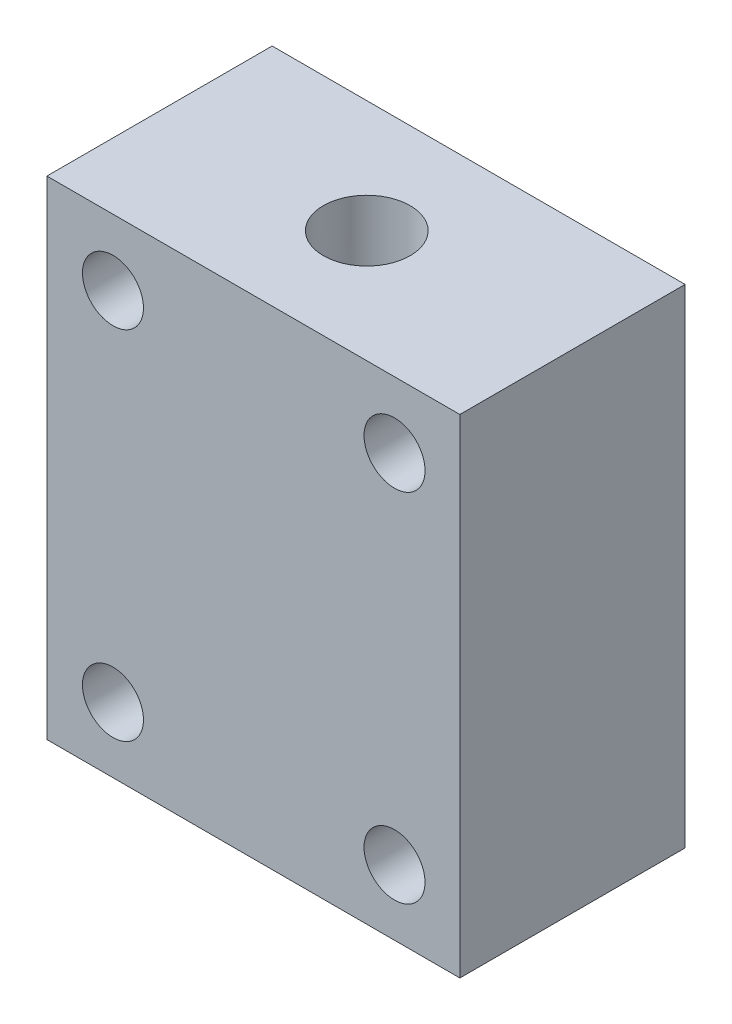
ISO-10303-21;
HEADER;
FILE_DESCRIPTION(('STEP AP214'),'2;1');
FILE_NAME('part.step','',(''),(''),'','','');
FILE_SCHEMA(('AUTOMOTIVE_DESIGN { 1 0 10303 214 1 1 1 1 }'));
ENDSEC;
DATA;
#1=APPLICATION_CONTEXT('core data for automotive mechanical design processes');
#2=APPLICATION_PROTOCOL_DEFINITION('international standard','automotive_design',2000,#1);
#3=PRODUCT_CONTEXT('',#1,'mechanical');
#4=PRODUCT('Part','Part','',(#3));
#5=PRODUCT_RELATED_PRODUCT_CATEGORY('part','',(#4));
#6=PRODUCT_DEFINITION_FORMATION('','',#4);
#7=PRODUCT_DEFINITION_CONTEXT('part definition',#1,'design');
#8=PRODUCT_DEFINITION('design','',#6,#7);
#9=PRODUCT_DEFINITION_SHAPE('','',#8);
#10=(LENGTH_UNIT() NAMED_UNIT(*) SI_UNIT(.MILLI.,.METRE.));
#11=(NAMED_UNIT(*) PLANE_ANGLE_UNIT() SI_UNIT($,.RADIAN.));
#12=(NAMED_UNIT(*) SI_UNIT($,.STERADIAN.) SOLID_ANGLE_UNIT());
#13=UNCERTAINTY_MEASURE_WITH_UNIT(LENGTH_MEASURE(1.E-05),#10,'distance_accuracy_value','');
#14=(GEOMETRIC_REPRESENTATION_CONTEXT(3) GLOBAL_UNCERTAINTY_ASSIGNED_CONTEXT((#13)) GLOBAL_UNIT_ASSIGNED_CONTEXT((#10,
#11,#12)) REPRESENTATION_CONTEXT('',''));
#15=CARTESIAN_POINT('',(0.,0.,0.));
#16=DIRECTION('',(0.,0.,1.));
#17=DIRECTION('',(1.,0.,0.));
#18=AXIS2_PLACEMENT_3D('',#15,#16,#17);
#19=CARTESIAN_POINT('',(34.925,41.275,19.05));
#20=DIRECTION('',(0.,-1.,0.));
#21=DIRECTION('',(0.,0.,-1.));
#22=AXIS2_PLACEMENT_3D('',#19,#20,#21);
#23=PLANE('',#22);
#24=CARTESIAN_POINT('',(0.126999999999997,41.275,0.));
#25=DIRECTION('',(0.,1.,0.));
#26=DIRECTION('',(0.,0.,1.));
#27=AXIS2_PLACEMENT_3D('',#24,#25,#26);
#28=CIRCLE('',#27,7.3421875);
#29=CARTESIAN_POINT('',(0.126999999999997,41.275,7.3421875));
#30=VERTEX_POINT('',#29);
#31=EDGE_CURVE('E224',#30,#30,#28,.T.);
#32=ORIENTED_EDGE('',*,*,#31,.F.);
#33=EDGE_LOOP('',(#32));
#34=FACE_BOUND('',#33,.T.);
#35=DIRECTION('',(-1.,0.,0.));
#36=VECTOR('',#35,1.);
#37=CARTESIAN_POINT('',(34.925,41.275,-19.05));
#38=LINE('',#37,#36);
#39=CARTESIAN_POINT('',(34.925,41.275,-19.05));
#40=VERTEX_POINT('',#39);
#41=CARTESIAN_POINT('',(-34.925,41.275,-19.05));
#42=VERTEX_POINT('',#41);
#43=EDGE_CURVE('E178',#40,#42,#38,.T.);
#44=ORIENTED_EDGE('',*,*,#43,.T.);
#45=DIRECTION('',(0.,0.,-1.));
#46=VECTOR('',#45,1.);
#47=CARTESIAN_POINT('',(-34.925,41.275,19.05));
#48=LINE('',#47,#46);
#49=CARTESIAN_POINT('',(-34.925,41.275,19.05));
#50=VERTEX_POINT('',#49);
#51=EDGE_CURVE('E205',#50,#42,#48,.T.);
#52=ORIENTED_EDGE('',*,*,#51,.F.);
#53=DIRECTION('',(-1.,0.,0.));
#54=VECTOR('',#53,1.);
#55=CARTESIAN_POINT('',(34.925,41.275,19.05));
#56=LINE('',#55,#54);
#57=CARTESIAN_POINT('',(34.925,41.275,19.05));
#58=VERTEX_POINT('',#57);
#59=EDGE_CURVE('E179',#58,#50,#56,.T.);
#60=ORIENTED_EDGE('',*,*,#59,.F.);
#61=DIRECTION('',(0.,0.,-1.));
#62=VECTOR('',#61,1.);
#63=CARTESIAN_POINT('',(34.925,41.275,19.05));
#64=LINE('',#63,#62);
#65=EDGE_CURVE('E189',#58,#40,#64,.T.);
#66=ORIENTED_EDGE('',*,*,#65,.T.);
#67=EDGE_LOOP('',(#44,#52,#60,#66));
#68=FACE_BOUND('',#67,.T.);
#69=ADVANCED_FACE('F43',(#34,#68),#23,.F.);
#70=CARTESIAN_POINT('',(-34.925,-41.275,19.05));
#71=DIRECTION('',(1.,0.,0.));
#72=DIRECTION('',(0.,0.,-1.));
#73=AXIS2_PLACEMENT_3D('',#70,#71,#72);
#74=PLANE('',#73);
#75=DIRECTION('',(0.,-1.,0.));
#76=VECTOR('',#75,1.);
#77=CARTESIAN_POINT('',(-34.925,-41.275,-19.05));
#78=LINE('',#77,#76);
#79=CARTESIAN_POINT('',(-34.925,-41.275,-19.05));
#80=VERTEX_POINT('',#79);
#81=EDGE_CURVE('E192',#42,#80,#78,.T.);
#82=ORIENTED_EDGE('',*,*,#81,.T.);
#83=DIRECTION('',(0.,0.,-1.));
#84=VECTOR('',#83,1.);
#85=CARTESIAN_POINT('',(-34.925,-41.275,19.05));
#86=LINE('',#85,#84);
#87=CARTESIAN_POINT('',(-34.925,-41.275,19.05));
#88=VERTEX_POINT('',#87);
#89=EDGE_CURVE('E202',#88,#80,#86,.T.);
#90=ORIENTED_EDGE('',*,*,#89,.F.);
#91=DIRECTION('',(0.,-1.,0.));
#92=VECTOR('',#91,1.);
#93=CARTESIAN_POINT('',(-34.925,-41.275,19.05));
#94=LINE('',#93,#92);
#95=EDGE_CURVE('E182',#50,#88,#94,.T.);
#96=ORIENTED_EDGE('',*,*,#95,.F.);
#97=ORIENTED_EDGE('',*,*,#51,.T.);
#98=EDGE_LOOP('',(#82,#90,#96,#97));
#99=FACE_BOUND('',#98,.T.);
#100=ADVANCED_FACE('F232',(#99),#74,.F.);
#101=CARTESIAN_POINT('',(34.925,-41.275,19.05));
#102=DIRECTION('',(0.,1.,0.));
#103=DIRECTION('',(0.,0.,1.));
#104=AXIS2_PLACEMENT_3D('',#101,#102,#103);
#105=PLANE('',#104);
#106=DIRECTION('',(1.,0.,0.));
#107=VECTOR('',#106,1.);
#108=CARTESIAN_POINT('',(34.925,-41.275,-19.05));
#109=LINE('',#108,#107);
#110=CARTESIAN_POINT('',(34.925,-41.275,-19.05));
#111=VERTEX_POINT('',#110);
#112=EDGE_CURVE('E194',#80,#111,#109,.T.);
#113=ORIENTED_EDGE('',*,*,#112,.T.);
#114=DIRECTION('',(0.,0.,-1.));
#115=VECTOR('',#114,1.);
#116=CARTESIAN_POINT('',(34.925,-41.275,19.05));
#117=LINE('',#116,#115);
#118=CARTESIAN_POINT('',(34.925,-41.275,19.05));
#119=VERTEX_POINT('',#118);
#120=EDGE_CURVE('E199',#119,#111,#117,.T.);
#121=ORIENTED_EDGE('',*,*,#120,.F.);
#122=DIRECTION('',(1.,0.,0.));
#123=VECTOR('',#122,1.);
#124=CARTESIAN_POINT('',(34.925,-41.275,19.05));
#125=LINE('',#124,#123);
#126=EDGE_CURVE('E185',#88,#119,#125,.T.);
#127=ORIENTED_EDGE('',*,*,#126,.F.);
#128=ORIENTED_EDGE('',*,*,#89,.T.);
#129=EDGE_LOOP('',(#113,#121,#127,#128));
#130=FACE_BOUND('',#129,.T.);
#131=ADVANCED_FACE('F251',(#130),#105,.F.);
#132=CARTESIAN_POINT('',(34.925,-41.275,19.05));
#133=DIRECTION('',(-1.,0.,0.));
#134=DIRECTION('',(0.,0.,1.));
#135=AXIS2_PLACEMENT_3D('',#132,#133,#134);
#136=PLANE('',#135);
#137=DIRECTION('',(0.,1.,0.));
#138=VECTOR('',#137,1.);
#139=CARTESIAN_POINT('',(34.925,-41.275,-19.05));
#140=LINE('',#139,#138);
#141=EDGE_CURVE('E183',#111,#40,#140,.T.);
#142=ORIENTED_EDGE('',*,*,#141,.T.);
#143=ORIENTED_EDGE('',*,*,#65,.F.);
#144=DIRECTION('',(0.,1.,0.));
#145=VECTOR('',#144,1.);
#146=CARTESIAN_POINT('',(34.925,-41.275,19.05));
#147=LINE('',#146,#145);
#148=EDGE_CURVE('E187',#119,#58,#147,.T.);
#149=ORIENTED_EDGE('',*,*,#148,.F.);
#150=ORIENTED_EDGE('',*,*,#120,.T.);
#151=EDGE_LOOP('',(#142,#143,#149,#150));
#152=FACE_BOUND('',#151,.T.);
#153=ADVANCED_FACE('F249',(#152),#136,.F.);
#154=CARTESIAN_POINT('',(0.,0.,19.05));
#155=DIRECTION('',(0.,0.,-1.));
#156=DIRECTION('',(-1.,0.,0.));
#157=AXIS2_PLACEMENT_3D('',#154,#155,#156);
#158=PLANE('',#157);
#159=CARTESIAN_POINT('',(23.876,-30.226,19.05));
#160=DIRECTION('',(0.,0.,-1.));
#161=DIRECTION('',(-1.,0.,0.));
#162=AXIS2_PLACEMENT_3D('',#159,#160,#161);
#163=CIRCLE('',#162,5.15937499999998);
#164=CARTESIAN_POINT('',(18.716625,-30.226,19.05));
#165=VERTEX_POINT('',#164);
#166=EDGE_CURVE('E157',#165,#165,#163,.T.);
#167=ORIENTED_EDGE('',*,*,#166,.T.);
#168=EDGE_LOOP('',(#167));
#169=FACE_BOUND('',#168,.T.);
#170=CARTESIAN_POINT('',(23.876,30.099,19.05));
#171=DIRECTION('',(0.,0.,-1.));
#172=DIRECTION('',(-1.,0.,0.));
#173=AXIS2_PLACEMENT_3D('',#170,#171,#172);
#174=CIRCLE('',#173,5.15937499999998);
#175=CARTESIAN_POINT('',(18.716625,30.099,19.05));
#176=VERTEX_POINT('',#175);
#177=EDGE_CURVE('E163',#176,#176,#174,.T.);
#178=ORIENTED_EDGE('',*,*,#177,.T.);
#179=EDGE_LOOP('',(#178));
#180=FACE_BOUND('',#179,.T.);
#181=CARTESIAN_POINT('',(-23.749,-30.226,19.05));
#182=DIRECTION('',(0.,0.,-1.));
#183=DIRECTION('',(-1.,0.,0.));
#184=AXIS2_PLACEMENT_3D('',#181,#182,#183);
#185=CIRCLE('',#184,5.15937499999998);
#186=CARTESIAN_POINT('',(-28.908375,-30.226,19.05));
#187=VERTEX_POINT('',#186);
#188=EDGE_CURVE('E169',#187,#187,#185,.T.);
#189=ORIENTED_EDGE('',*,*,#188,.T.);
#190=EDGE_LOOP('',(#189));
#191=FACE_BOUND('',#190,.T.);
#192=CARTESIAN_POINT('',(-23.749,30.099,19.05));
#193=DIRECTION('',(0.,0.,-1.));
#194=DIRECTION('',(-1.,0.,0.));
#195=AXIS2_PLACEMENT_3D('',#192,#193,#194);
#196=CIRCLE('',#195,5.15937499999998);
#197=CARTESIAN_POINT('',(-28.908375,30.099,19.05));
#198=VERTEX_POINT('',#197);
#199=EDGE_CURVE('E175',#198,#198,#196,.T.);
#200=ORIENTED_EDGE('',*,*,#199,.T.);
#201=EDGE_LOOP('',(#200));
#202=FACE_BOUND('',#201,.T.);
#203=ORIENTED_EDGE('',*,*,#59,.T.);
#204=ORIENTED_EDGE('',*,*,#95,.T.);
#205=ORIENTED_EDGE('',*,*,#126,.T.);
#206=ORIENTED_EDGE('',*,*,#148,.T.);
#207=EDGE_LOOP('',(#203,#204,#205,#206));
#208=FACE_BOUND('',#207,.T.);
#209=ADVANCED_FACE('F245',(#169,#180,#191,#202,#208),#158,.F.);
#210=CARTESIAN_POINT('',(0.,0.,-19.05));
#211=DIRECTION('',(0.,0.,-1.));
#212=DIRECTION('',(-1.,0.,0.));
#213=AXIS2_PLACEMENT_3D('',#210,#211,#212);
#214=PLANE('',#213);
#215=CARTESIAN_POINT('',(0.126999999999997,-17.653,-19.05));
#216=DIRECTION('',(0.,0.,1.));
#217=DIRECTION('',(1.,0.,0.));
#218=AXIS2_PLACEMENT_3D('',#215,#216,#217);
#219=CIRCLE('',#218,12.7254);
#220=CARTESIAN_POINT('',(12.8524,-17.653,-19.05));
#221=VERTEX_POINT('',#220);
#222=EDGE_CURVE('E143',#221,#221,#219,.T.);
#223=ORIENTED_EDGE('',*,*,#222,.T.);
#224=EDGE_LOOP('',(#223));
#225=FACE_BOUND('',#224,.T.);
#226=CARTESIAN_POINT('',(0.126999999999997,17.399,-19.05));
#227=DIRECTION('',(0.,0.,1.));
#228=DIRECTION('',(1.,0.,0.));
#229=AXIS2_PLACEMENT_3D('',#226,#227,#228);
#230=CIRCLE('',#229,12.7254);
#231=CARTESIAN_POINT('',(12.8524,17.399,-19.05));
#232=VERTEX_POINT('',#231);
#233=EDGE_CURVE('E138',#232,#232,#230,.T.);
#234=ORIENTED_EDGE('',*,*,#233,.T.);
#235=EDGE_LOOP('',(#234));
#236=FACE_BOUND('',#235,.T.);
#237=CARTESIAN_POINT('',(23.876,-30.226,-19.05));
#238=DIRECTION('',(0.,0.,-1.));
#239=DIRECTION('',(-1.,0.,0.));
#240=AXIS2_PLACEMENT_3D('',#237,#238,#239);
#241=CIRCLE('',#240,5.15937499999999);
#242=CARTESIAN_POINT('',(18.716625,-30.226,-19.05));
#243=VERTEX_POINT('',#242);
#244=EDGE_CURVE('E150',#243,#243,#241,.T.);
#245=ORIENTED_EDGE('',*,*,#244,.F.);
#246=EDGE_LOOP('',(#245));
#247=FACE_BOUND('',#246,.T.);
#248=CARTESIAN_POINT('',(23.876,30.099,-19.05));
#249=DIRECTION('',(0.,0.,-1.));
#250=DIRECTION('',(-1.,0.,0.));
#251=AXIS2_PLACEMENT_3D('',#248,#249,#250);
#252=CIRCLE('',#251,5.15937499999999);
#253=CARTESIAN_POINT('',(18.716625,30.099,-19.05));
#254=VERTEX_POINT('',#253);
#255=EDGE_CURVE('E160',#254,#254,#252,.T.);
#256=ORIENTED_EDGE('',*,*,#255,.F.);
#257=EDGE_LOOP('',(#256));
#258=FACE_BOUND('',#257,.T.);
#259=CARTESIAN_POINT('',(-23.749,-30.226,-19.05));
#260=DIRECTION('',(0.,0.,-1.));
#261=DIRECTION('',(-1.,0.,0.));
#262=AXIS2_PLACEMENT_3D('',#259,#260,#261);
#263=CIRCLE('',#262,5.15937499999999);
#264=CARTESIAN_POINT('',(-28.908375,-30.226,-19.05));
#265=VERTEX_POINT('',#264);
#266=EDGE_CURVE('E166',#265,#265,#263,.T.);
#267=ORIENTED_EDGE('',*,*,#266,.F.);
#268=EDGE_LOOP('',(#267));
#269=FACE_BOUND('',#268,.T.);
#270=CARTESIAN_POINT('',(-23.749,30.099,-19.05));
#271=DIRECTION('',(0.,0.,-1.));
#272=DIRECTION('',(-1.,0.,0.));
#273=AXIS2_PLACEMENT_3D('',#270,#271,#272);
#274=CIRCLE('',#273,5.15937499999999);
#275=CARTESIAN_POINT('',(-28.908375,30.099,-19.05));
#276=VERTEX_POINT('',#275);
#277=EDGE_CURVE('E172',#276,#276,#274,.T.);
#278=ORIENTED_EDGE('',*,*,#277,.F.);
#279=EDGE_LOOP('',(#278));
#280=FACE_BOUND('',#279,.T.);
#281=ORIENTED_EDGE('',*,*,#43,.F.);
#282=ORIENTED_EDGE('',*,*,#141,.F.);
#283=ORIENTED_EDGE('',*,*,#112,.F.);
#284=ORIENTED_EDGE('',*,*,#81,.F.);
#285=EDGE_LOOP('',(#281,#282,#283,#284));
#286=FACE_BOUND('',#285,.T.);
#287=ADVANCED_FACE('F239',(#225,#236,#247,#258,#269,#280,#286),#214,.T.);
#288=CARTESIAN_POINT('',(-23.749,30.099,-19.05));
#289=DIRECTION('',(0.,0.,-1.));
#290=DIRECTION('',(-1.,0.,0.));
#291=AXIS2_PLACEMENT_3D('',#288,#289,#290);
#292=CYLINDRICAL_SURFACE('',#291,5.15937499999998);
#293=ORIENTED_EDGE('',*,*,#199,.F.);
#294=EDGE_LOOP('',(#293));
#295=FACE_BOUND('',#294,.T.);
#296=ORIENTED_EDGE('',*,*,#277,.T.);
#297=EDGE_LOOP('',(#296));
#298=FACE_BOUND('',#297,.T.);
#299=ADVANCED_FACE('F262',(#295,#298),#292,.F.);
#300=CARTESIAN_POINT('',(-23.749,-30.226,-19.05));
#301=DIRECTION('',(0.,0.,-1.));
#302=DIRECTION('',(-1.,0.,0.));
#303=AXIS2_PLACEMENT_3D('',#300,#301,#302);
#304=CYLINDRICAL_SURFACE('',#303,5.15937499999998);
#305=ORIENTED_EDGE('',*,*,#188,.F.);
#306=EDGE_LOOP('',(#305));
#307=FACE_BOUND('',#306,.T.);
#308=ORIENTED_EDGE('',*,*,#266,.T.);
#309=EDGE_LOOP('',(#308));
#310=FACE_BOUND('',#309,.T.);
#311=ADVANCED_FACE('F269',(#307,#310),#304,.F.);
#312=CARTESIAN_POINT('',(23.876,30.099,-19.05));
#313=DIRECTION('',(0.,0.,-1.));
#314=DIRECTION('',(-1.,0.,0.));
#315=AXIS2_PLACEMENT_3D('',#312,#313,#314);
#316=CYLINDRICAL_SURFACE('',#315,5.15937499999998);
#317=ORIENTED_EDGE('',*,*,#177,.F.);
#318=EDGE_LOOP('',(#317));
#319=FACE_BOUND('',#318,.T.);
#320=ORIENTED_EDGE('',*,*,#255,.T.);
#321=EDGE_LOOP('',(#320));
#322=FACE_BOUND('',#321,.T.);
#323=ADVANCED_FACE('F273',(#319,#322),#316,.F.);
#324=CARTESIAN_POINT('',(23.876,-30.226,-19.05));
#325=DIRECTION('',(0.,0.,-1.));
#326=DIRECTION('',(-1.,0.,0.));
#327=AXIS2_PLACEMENT_3D('',#324,#325,#326);
#328=CYLINDRICAL_SURFACE('',#327,5.15937499999998);
#329=ORIENTED_EDGE('',*,*,#166,.F.);
#330=EDGE_LOOP('',(#329));
#331=FACE_BOUND('',#330,.T.);
#332=ORIENTED_EDGE('',*,*,#244,.T.);
#333=EDGE_LOOP('',(#332));
#334=FACE_BOUND('',#333,.T.);
#335=ADVANCED_FACE('F277',(#331,#334),#328,.F.);
#336=CARTESIAN_POINT('',(0.126999999999997,-17.653,-16.2306));
#337=DIRECTION('',(0.,0.,-1.));
#338=DIRECTION('',(-1.,0.,0.));
#339=AXIS2_PLACEMENT_3D('',#336,#337,#338);
#340=CYLINDRICAL_SURFACE('',#339,12.7254);
#341=CARTESIAN_POINT('',(0.126999999999997,-17.653,-16.2306));
#342=DIRECTION('',(0.,0.,1.));
#343=DIRECTION('',(1.,0.,0.));
#344=AXIS2_PLACEMENT_3D('',#341,#342,#343);
#345=CIRCLE('',#344,12.7254);
#346=CARTESIAN_POINT('',(12.8524,-17.653,-16.2306));
#347=VERTEX_POINT('',#346);
#348=EDGE_CURVE('E211',#347,#347,#345,.T.);
#349=ORIENTED_EDGE('',*,*,#348,.T.);
#350=EDGE_LOOP('',(#349));
#351=FACE_BOUND('',#350,.T.);
#352=ORIENTED_EDGE('',*,*,#222,.F.);
#353=EDGE_LOOP('',(#352));
#354=FACE_BOUND('',#353,.T.);
#355=ADVANCED_FACE('F281',(#351,#354),#340,.F.);
#356=CARTESIAN_POINT('',(0.126999999999997,-17.653,-16.2306));
#357=DIRECTION('',(0.,0.,1.));
#358=DIRECTION('',(1.,0.,0.));
#359=AXIS2_PLACEMENT_3D('',#356,#357,#358);
#360=PLANE('',#359);
#361=CARTESIAN_POINT('',(0.126999999999997,-17.653,-16.2306));
#362=DIRECTION('',(0.,0.,1.));
#363=DIRECTION('',(1.,0.,0.));
#364=AXIS2_PLACEMENT_3D('',#361,#362,#363);
#365=CIRCLE('',#364,7.3421875);
#366=CARTESIAN_POINT('',(7.4691875,-17.653,-16.2306));
#367=VERTEX_POINT('',#366);
#368=EDGE_CURVE('E208',#367,#367,#365,.T.);
#369=ORIENTED_EDGE('',*,*,#368,.T.);
#370=EDGE_LOOP('',(#369));
#371=FACE_BOUND('',#370,.T.);
#372=ORIENTED_EDGE('',*,*,#348,.F.);
#373=EDGE_LOOP('',(#372));
#374=FACE_BOUND('',#373,.T.);
#375=ADVANCED_FACE('F306',(#371,#374),#360,.F.);
#376=CARTESIAN_POINT('',(0.126999999999997,17.399,-16.2306));
#377=DIRECTION('',(0.,0.,-1.));
#378=DIRECTION('',(-1.,0.,0.));
#379=AXIS2_PLACEMENT_3D('',#376,#377,#378);
#380=CYLINDRICAL_SURFACE('',#379,12.7254);
#381=CARTESIAN_POINT('',(0.126999999999997,17.399,-16.2306));
#382=DIRECTION('',(0.,0.,1.));
#383=DIRECTION('',(1.,0.,0.));
#384=AXIS2_PLACEMENT_3D('',#381,#382,#383);
#385=CIRCLE('',#384,12.7254);
#386=CARTESIAN_POINT('',(12.8524,17.399,-16.2306));
#387=VERTEX_POINT('',#386);
#388=EDGE_CURVE('E136',#387,#387,#385,.T.);
#389=ORIENTED_EDGE('',*,*,#388,.T.);
#390=EDGE_LOOP('',(#389));
#391=FACE_BOUND('',#390,.T.);
#392=ORIENTED_EDGE('',*,*,#233,.F.);
#393=EDGE_LOOP('',(#392));
#394=FACE_BOUND('',#393,.T.);
#395=ADVANCED_FACE('F302',(#391,#394),#380,.F.);
#396=CARTESIAN_POINT('',(0.126999999999997,17.399,-16.2306));
#397=DIRECTION('',(0.,0.,1.));
#398=DIRECTION('',(1.,0.,0.));
#399=AXIS2_PLACEMENT_3D('',#396,#397,#398);
#400=PLANE('',#399);
#401=CARTESIAN_POINT('',(0.126999999999997,17.399,-16.2306));
#402=DIRECTION('',(0.,0.,1.));
#403=DIRECTION('',(1.,0.,0.));
#404=AXIS2_PLACEMENT_3D('',#401,#402,#403);
#405=CIRCLE('',#404,7.3421875);
#406=CARTESIAN_POINT('',(7.4691875,17.399,-16.2306));
#407=VERTEX_POINT('',#406);
#408=EDGE_CURVE('E154',#407,#407,#405,.T.);
#409=ORIENTED_EDGE('',*,*,#408,.T.);
#410=EDGE_LOOP('',(#409));
#411=FACE_BOUND('',#410,.T.);
#412=ORIENTED_EDGE('',*,*,#388,.F.);
#413=EDGE_LOOP('',(#412));
#414=FACE_BOUND('',#413,.T.);
#415=ADVANCED_FACE('F298',(#411,#414),#400,.F.);
#416=CARTESIAN_POINT('',(0.126999999999997,-17.653,9.398));
#417=DIRECTION('',(0.,0.,1.));
#418=DIRECTION('',(1.,0.,0.));
#419=AXIS2_PLACEMENT_3D('',#416,#417,#418);
#420=PLANE('',#419);
#421=CARTESIAN_POINT('',(0.126999999999997,-17.653,9.398));
#422=DIRECTION('',(0.,0.,1.));
#423=DIRECTION('',(1.,0.,0.));
#424=AXIS2_PLACEMENT_3D('',#421,#422,#423);
#425=CIRCLE('',#424,7.3421875);
#426=CARTESIAN_POINT('',(7.4691875,-17.653,9.398));
#427=VERTEX_POINT('',#426);
#428=EDGE_CURVE('E147',#427,#427,#425,.T.);
#429=ORIENTED_EDGE('',*,*,#428,.F.);
#430=EDGE_LOOP('',(#429));
#431=FACE_BOUND('',#430,.T.);
#432=ADVANCED_FACE('F295',(#431),#420,.F.);
#433=CARTESIAN_POINT('',(0.126999999999997,-17.653,9.398));
#434=DIRECTION('',(0.,0.,-1.));
#435=DIRECTION('',(-1.,0.,0.));
#436=AXIS2_PLACEMENT_3D('',#433,#434,#435);
#437=CYLINDRICAL_SURFACE('',#436,7.3421875);
#438=CARTESIAN_POINT('',(0.126999999999997,-17.653,0.));
#439=DIRECTION('',(0.,-0.707106781186547,-0.707106781186547));
#440=DIRECTION('',(0.,0.707106781186547,-0.707106781186547));
#441=AXIS2_PLACEMENT_3D('',#438,#439,#440);
#442=ELLIPSE('',#441,10.3834211399862,7.3421875);
#443=CARTESIAN_POINT('',(7.30927967188387,-19.177,1.52399999999999));
#444=VERTEX_POINT('',#443);
#445=CARTESIAN_POINT('',(7.4691875,-17.653,0.));
#446=VERTEX_POINT('',#445);
#447=EDGE_CURVE('E57',#444,#446,#442,.F.);
#448=ORIENTED_EDGE('',*,*,#447,.F.);
#449=DIRECTION('',(0.,0.,-1.));
#450=VECTOR('',#449,1.);
#451=CARTESIAN_POINT('',(7.30927967188387,-19.177,9.398));
#452=LINE('',#451,#450);
#453=CARTESIAN_POINT('',(7.30927967188387,-19.177,-1.52399999999999));
#454=VERTEX_POINT('',#453);
#455=EDGE_CURVE('E11',#444,#454,#452,.T.);
#456=ORIENTED_EDGE('',*,*,#455,.T.);
#457=CARTESIAN_POINT('',(0.126999999999997,-17.653,0.));
#458=DIRECTION('',(0.,0.707106781186547,-0.707106781186547));
#459=DIRECTION('',(0.,-0.707106781186547,-0.707106781186547));
#460=AXIS2_PLACEMENT_3D('',#457,#458,#459);
#461=ELLIPSE('',#460,10.3834211399862,7.3421875);
#462=EDGE_CURVE('E113',#446,#454,#461,.T.);
#463=ORIENTED_EDGE('',*,*,#462,.F.);
#464=CARTESIAN_POINT('',(0.126999999999997,-17.653,0.));
#465=DIRECTION('',(0.,-0.707106781186547,-0.707106781186547));
#466=DIRECTION('',(0.,0.707106781186547,-0.707106781186547));
#467=AXIS2_PLACEMENT_3D('',#464,#465,#466);
#468=ELLIPSE('',#467,10.3834211399862,7.3421875);
#469=CARTESIAN_POINT('',(-7.2151875,-17.653,0.));
#470=VERTEX_POINT('',#469);
#471=EDGE_CURVE('E121',#470,#446,#468,.T.);
#472=ORIENTED_EDGE('',*,*,#471,.F.);
#473=CARTESIAN_POINT('',(-7.05527967188387,-19.177,-1.52399999999999));
#474=VERTEX_POINT('',#473);
#475=EDGE_CURVE('E124',#474,#470,#461,.T.);
#476=ORIENTED_EDGE('',*,*,#475,.F.);
#477=DIRECTION('',(0.,0.,-1.));
#478=VECTOR('',#477,1.);
#479=CARTESIAN_POINT('',(-7.05527967188387,-19.177,9.398));
#480=LINE('',#479,#478);
#481=CARTESIAN_POINT('',(-7.05527967188387,-19.177,1.52399999999999));
#482=VERTEX_POINT('',#481);
#483=EDGE_CURVE('E50',#474,#482,#480,.F.);
#484=ORIENTED_EDGE('',*,*,#483,.T.);
#485=EDGE_CURVE('E123',#470,#482,#442,.F.);
#486=ORIENTED_EDGE('',*,*,#485,.F.);
#487=CARTESIAN_POINT('',(0.126999999999997,-17.653,0.));
#488=DIRECTION('',(0.,0.707106781186547,-0.707106781186547));
#489=DIRECTION('',(0.,-0.707106781186547,-0.707106781186547));
#490=AXIS2_PLACEMENT_3D('',#487,#488,#489);
#491=ELLIPSE('',#490,10.3834211399862,7.3421875);
#492=EDGE_CURVE('E120',#446,#470,#491,.F.);
#493=ORIENTED_EDGE('',*,*,#492,.F.);
#494=EDGE_LOOP('',(#448,#456,#463,#472,#476,#484,#486,#493));
#495=FACE_BOUND('',#494,.T.);
#496=ORIENTED_EDGE('',*,*,#368,.F.);
#497=EDGE_LOOP('',(#496));
#498=FACE_BOUND('',#497,.T.);
#499=ORIENTED_EDGE('',*,*,#428,.T.);
#500=EDGE_LOOP('',(#499));
#501=FACE_BOUND('',#500,.T.);
#502=ADVANCED_FACE('F117',(#495,#498,#501),#437,.F.);
#503=CARTESIAN_POINT('',(0.126999999999997,17.399,9.398));
#504=DIRECTION('',(0.,0.,-1.));
#505=DIRECTION('',(-1.,0.,0.));
#506=AXIS2_PLACEMENT_3D('',#503,#504,#505);
#507=CYLINDRICAL_SURFACE('',#506,7.3421875);
#508=CARTESIAN_POINT('',(0.126999999999997,17.399,0.));
#509=DIRECTION('',(0.,0.707106781186547,-0.707106781186547));
#510=DIRECTION('',(0.,-0.707106781186547,-0.707106781186547));
#511=AXIS2_PLACEMENT_3D('',#508,#509,#510);
#512=ELLIPSE('',#511,10.3834211399862,7.3421875);
#513=CARTESIAN_POINT('',(7.4691875,17.399,0.));
#514=VERTEX_POINT('',#513);
#515=CARTESIAN_POINT('',(-7.2151875,17.399,0.));
#516=VERTEX_POINT('',#515);
#517=EDGE_CURVE('E217',#514,#516,#512,.T.);
#518=ORIENTED_EDGE('',*,*,#517,.F.);
#519=CARTESIAN_POINT('',(0.126999999999997,17.399,0.));
#520=DIRECTION('',(0.,-0.707106781186547,-0.707106781186547));
#521=DIRECTION('',(0.,0.707106781186547,-0.707106781186547));
#522=AXIS2_PLACEMENT_3D('',#519,#520,#521);
#523=ELLIPSE('',#522,10.3834211399862,7.3421875);
#524=EDGE_CURVE('E215',#516,#514,#523,.T.);
#525=ORIENTED_EDGE('',*,*,#524,.F.);
#526=EDGE_LOOP('',(#518,#525));
#527=FACE_BOUND('',#526,.T.);
#528=ORIENTED_EDGE('',*,*,#408,.F.);
#529=EDGE_LOOP('',(#528));
#530=FACE_BOUND('',#529,.T.);
#531=ADVANCED_FACE('F288',(#527,#530),#507,.F.);
#532=CARTESIAN_POINT('',(0.126999999999997,-19.177,0.));
#533=DIRECTION('',(0.,1.,0.));
#534=DIRECTION('',(0.,0.,1.));
#535=AXIS2_PLACEMENT_3D('',#532,#533,#534);
#536=CYLINDRICAL_SURFACE('',#535,7.3421875);
#537=ORIENTED_EDGE('',*,*,#492,.T.);
#538=ORIENTED_EDGE('',*,*,#471,.T.);
#539=EDGE_LOOP('',(#537,#538));
#540=FACE_BOUND('',#539,.T.);
#541=ORIENTED_EDGE('',*,*,#517,.T.);
#542=CARTESIAN_POINT('',(0.126999999999997,17.399,0.));
#543=DIRECTION('',(0.,-0.707106781186547,-0.707106781186547));
#544=DIRECTION('',(0.,0.707106781186547,-0.707106781186547));
#545=AXIS2_PLACEMENT_3D('',#542,#543,#544);
#546=ELLIPSE('',#545,10.3834211399862,7.3421875);
#547=EDGE_CURVE('E64',#516,#514,#546,.F.);
#548=ORIENTED_EDGE('',*,*,#547,.T.);
#549=EDGE_LOOP('',(#541,#548));
#550=FACE_BOUND('',#549,.T.);
#551=ADVANCED_FACE('F291',(#540,#550),#536,.F.);
#552=CARTESIAN_POINT('',(0.126999999999997,17.399,0.));
#553=DIRECTION('',(0.,0.707106781186547,-0.707106781186547));
#554=DIRECTION('',(0.,-0.707106781186547,-0.707106781186547));
#555=AXIS2_PLACEMENT_3D('',#552,#553,#554);
#556=ELLIPSE('',#555,10.3834211399862,7.3421875);
#557=EDGE_CURVE('E219',#514,#516,#556,.F.);
#558=ORIENTED_EDGE('',*,*,#557,.T.);
#559=ORIENTED_EDGE('',*,*,#524,.T.);
#560=EDGE_LOOP('',(#558,#559));
#561=FACE_BOUND('',#560,.T.);
#562=ORIENTED_EDGE('',*,*,#31,.T.);
#563=EDGE_LOOP('',(#562));
#564=FACE_BOUND('',#563,.T.);
#565=ADVANCED_FACE('F228',(#561,#564),#536,.F.);
#566=CARTESIAN_POINT('',(0.126999999999997,-19.177,0.));
#567=DIRECTION('',(0.,1.,0.));
#568=DIRECTION('',(0.,0.,1.));
#569=AXIS2_PLACEMENT_3D('',#566,#567,#568);
#570=PLANE('',#569);
#571=CARTESIAN_POINT('',(0.126999999999997,-19.177,0.));
#572=DIRECTION('',(0.,1.,0.));
#573=DIRECTION('',(0.,0.,1.));
#574=AXIS2_PLACEMENT_3D('',#571,#572,#573);
#575=CIRCLE('',#574,7.3421875);
#576=EDGE_CURVE('E114',#474,#482,#575,.T.);
#577=ORIENTED_EDGE('',*,*,#576,.T.);
#578=ORIENTED_EDGE('',*,*,#483,.F.);
#579=EDGE_LOOP('',(#577,#578));
#580=FACE_BOUND('',#579,.T.);
#581=ADVANCED_FACE('F222',(#580),#570,.T.);
#582=ORIENTED_EDGE('',*,*,#485,.T.);
#583=ORIENTED_EDGE('',*,*,#576,.F.);
#584=ORIENTED_EDGE('',*,*,#475,.T.);
#585=EDGE_LOOP('',(#582,#583,#584));
#586=FACE_BOUND('',#585,.T.);
#587=ADVANCED_FACE('F223',(#586),#536,.F.);
#588=EDGE_CURVE('E109',#444,#454,#575,.T.);
#589=ORIENTED_EDGE('',*,*,#588,.T.);
#590=ORIENTED_EDGE('',*,*,#455,.F.);
#591=EDGE_LOOP('',(#589,#590));
#592=FACE_BOUND('',#591,.T.);
#593=ADVANCED_FACE('F108',(#592),#570,.T.);
#594=ORIENTED_EDGE('',*,*,#462,.T.);
#595=ORIENTED_EDGE('',*,*,#588,.F.);
#596=ORIENTED_EDGE('',*,*,#447,.T.);
#597=EDGE_LOOP('',(#594,#595,#596));
#598=FACE_BOUND('',#597,.T.);
#599=ADVANCED_FACE('F112',(#598),#536,.F.);
#600=CARTESIAN_POINT('',(0.126999999999997,17.399,9.398));
#601=DIRECTION('',(0.,0.,1.));
#602=DIRECTION('',(1.,0.,0.));
#603=AXIS2_PLACEMENT_3D('',#600,#601,#602);
#604=PLANE('',#603);
#605=CARTESIAN_POINT('',(0.126999999999997,17.399,9.398));
#606=DIRECTION('',(0.,0.,1.));
#607=DIRECTION('',(1.,0.,0.));
#608=AXIS2_PLACEMENT_3D('',#605,#606,#607);
#609=CIRCLE('',#608,7.3421875);
#610=CARTESIAN_POINT('',(7.4691875,17.399,9.398));
#611=VERTEX_POINT('',#610);
#612=EDGE_CURVE('E151',#611,#611,#609,.T.);
#613=ORIENTED_EDGE('',*,*,#612,.F.);
#614=EDGE_LOOP('',(#613));
#615=FACE_BOUND('',#614,.T.);
#616=ADVANCED_FACE('F283',(#615),#604,.F.);
#617=ORIENTED_EDGE('',*,*,#557,.F.);
#618=ORIENTED_EDGE('',*,*,#547,.F.);
#619=EDGE_LOOP('',(#617,#618));
#620=FACE_BOUND('',#619,.T.);
#621=ORIENTED_EDGE('',*,*,#612,.T.);
#622=EDGE_LOOP('',(#621));
#623=FACE_BOUND('',#622,.T.);
#624=ADVANCED_FACE('F286',(#620,#623),#507,.F.);
#625=CLOSED_SHELL('',(#69,#100,#131,#153,#209,#287,#299,#311,#323,#335,#355,#375,#395,#415,#432,
#502,#531,#551,#565,#581,#587,#593,#599,#616,#624));
#626=MANIFOLD_SOLID_BREP('B2',#625);
#627=ADVANCED_BREP_SHAPE_REPRESENTATION('',(#18,#626),#14);
#628=SHAPE_DEFINITION_REPRESENTATION(#9,#627);
ENDSEC;
END-ISO-10303-21;
